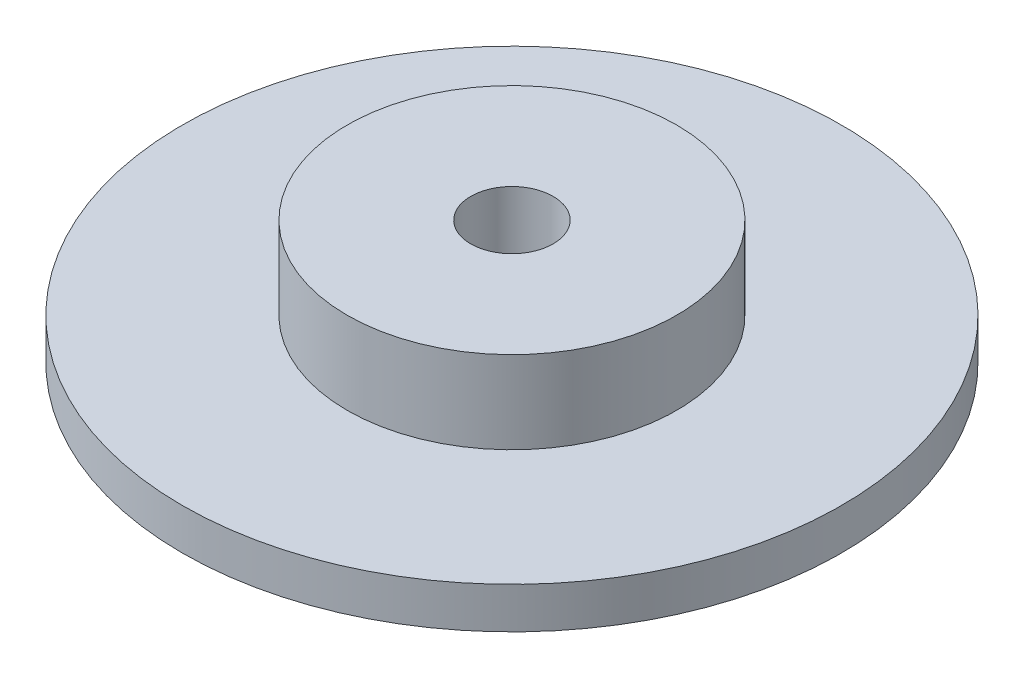
ISO-10303-21;
HEADER;
FILE_DESCRIPTION(('STEP AP214'),'2;1');
FILE_NAME('part.step','',(''),(''),'','','');
FILE_SCHEMA(('AUTOMOTIVE_DESIGN { 1 0 10303 214 1 1 1 1 }'));
ENDSEC;
DATA;
#1=APPLICATION_CONTEXT('core data for automotive mechanical design processes');
#2=APPLICATION_PROTOCOL_DEFINITION('international standard','automotive_design',2000,#1);
#3=PRODUCT_CONTEXT('',#1,'mechanical');
#4=PRODUCT('Part','Part','',(#3));
#5=PRODUCT_RELATED_PRODUCT_CATEGORY('part','',(#4));
#6=PRODUCT_DEFINITION_FORMATION('','',#4);
#7=PRODUCT_DEFINITION_CONTEXT('part definition',#1,'design');
#8=PRODUCT_DEFINITION('design','',#6,#7);
#9=PRODUCT_DEFINITION_SHAPE('','',#8);
#10=(LENGTH_UNIT() NAMED_UNIT(*) SI_UNIT(.MILLI.,.METRE.));
#11=(NAMED_UNIT(*) PLANE_ANGLE_UNIT() SI_UNIT($,.RADIAN.));
#12=(NAMED_UNIT(*) SI_UNIT($,.STERADIAN.) SOLID_ANGLE_UNIT());
#13=UNCERTAINTY_MEASURE_WITH_UNIT(LENGTH_MEASURE(1.E-05),#10,'distance_accuracy_value','');
#14=(GEOMETRIC_REPRESENTATION_CONTEXT(3) GLOBAL_UNCERTAINTY_ASSIGNED_CONTEXT((#13)) GLOBAL_UNIT_ASSIGNED_CONTEXT((#10,
#11,#12)) REPRESENTATION_CONTEXT('',''));
#15=CARTESIAN_POINT('',(0.,0.,0.));
#16=DIRECTION('',(0.,0.,1.));
#17=DIRECTION('',(1.,0.,0.));
#18=AXIS2_PLACEMENT_3D('',#15,#16,#17);
#19=CARTESIAN_POINT('',(0.,3.175,0.));
#20=DIRECTION('',(0.,1.,0.));
#21=DIRECTION('',(0.,0.,1.));
#22=AXIS2_PLACEMENT_3D('',#19,#20,#21);
#23=PLANE('',#22);
#24=CARTESIAN_POINT('',(0.,3.175,0.));
#25=DIRECTION('',(0.,1.,0.));
#26=DIRECTION('',(0.,0.,1.));
#27=AXIS2_PLACEMENT_3D('',#24,#25,#26);
#28=CIRCLE('',#27,25.4);
#29=CARTESIAN_POINT('',(0.,3.175,25.4));
#30=VERTEX_POINT('',#29);
#31=EDGE_CURVE('E10',#30,#30,#28,.T.);
#32=ORIENTED_EDGE('',*,*,#31,.T.);
#33=EDGE_LOOP('',(#32));
#34=FACE_BOUND('',#33,.T.);
#35=CARTESIAN_POINT('',(0.,3.175,0.));
#36=DIRECTION('',(0.,1.,0.));
#37=DIRECTION('',(0.,0.,1.));
#38=AXIS2_PLACEMENT_3D('',#35,#36,#37);
#39=CIRCLE('',#38,12.7);
#40=CARTESIAN_POINT('',(0.,3.175,12.7));
#41=VERTEX_POINT('',#40);
#42=EDGE_CURVE('E43',#41,#41,#39,.T.);
#43=ORIENTED_EDGE('',*,*,#42,.F.);
#44=EDGE_LOOP('',(#43));
#45=FACE_BOUND('',#44,.T.);
#46=ADVANCED_FACE('F30',(#34,#45),#23,.T.);
#47=CARTESIAN_POINT('',(0.,3.175,0.));
#48=DIRECTION('',(0.,-1.,0.));
#49=DIRECTION('',(0.,0.,-1.));
#50=AXIS2_PLACEMENT_3D('',#47,#48,#49);
#51=CYLINDRICAL_SURFACE('',#50,25.4);
#52=ORIENTED_EDGE('',*,*,#31,.F.);
#53=EDGE_LOOP('',(#52));
#54=FACE_BOUND('',#53,.T.);
#55=CARTESIAN_POINT('',(0.,0.,0.));
#56=DIRECTION('',(0.,1.,0.));
#57=DIRECTION('',(0.,0.,1.));
#58=AXIS2_PLACEMENT_3D('',#55,#56,#57);
#59=CIRCLE('',#58,25.4);
#60=CARTESIAN_POINT('',(0.,0.,25.4));
#61=VERTEX_POINT('',#60);
#62=EDGE_CURVE('E34',#61,#61,#59,.T.);
#63=ORIENTED_EDGE('',*,*,#62,.T.);
#64=EDGE_LOOP('',(#63));
#65=FACE_BOUND('',#64,.T.);
#66=ADVANCED_FACE('F32',(#54,#65),#51,.T.);
#67=CARTESIAN_POINT('',(0.,0.,0.));
#68=DIRECTION('',(0.,1.,0.));
#69=DIRECTION('',(0.,0.,1.));
#70=AXIS2_PLACEMENT_3D('',#67,#68,#69);
#71=PLANE('',#70);
#72=CARTESIAN_POINT('',(0.,0.,0.));
#73=DIRECTION('',(0.,1.,0.));
#74=DIRECTION('',(0.,0.,1.));
#75=AXIS2_PLACEMENT_3D('',#72,#73,#74);
#76=CIRCLE('',#75,3.175);
#77=CARTESIAN_POINT('',(0.,0.,3.175));
#78=VERTEX_POINT('',#77);
#79=EDGE_CURVE('E46',#78,#78,#76,.T.);
#80=ORIENTED_EDGE('',*,*,#79,.T.);
#81=EDGE_LOOP('',(#80));
#82=FACE_BOUND('',#81,.T.);
#83=ORIENTED_EDGE('',*,*,#62,.F.);
#84=EDGE_LOOP('',(#83));
#85=FACE_BOUND('',#84,.T.);
#86=ADVANCED_FACE('F55',(#82,#85),#71,.F.);
#87=CARTESIAN_POINT('',(0.,9.525,0.));
#88=DIRECTION('',(0.,-1.,0.));
#89=DIRECTION('',(0.,0.,-1.));
#90=AXIS2_PLACEMENT_3D('',#87,#88,#89);
#91=CYLINDRICAL_SURFACE('',#90,12.7);
#92=CARTESIAN_POINT('',(0.,9.525,0.));
#93=DIRECTION('',(0.,1.,0.));
#94=DIRECTION('',(0.,0.,1.));
#95=AXIS2_PLACEMENT_3D('',#92,#93,#94);
#96=CIRCLE('',#95,12.7);
#97=CARTESIAN_POINT('',(0.,9.525,12.7));
#98=VERTEX_POINT('',#97);
#99=EDGE_CURVE('E41',#98,#98,#96,.T.);
#100=ORIENTED_EDGE('',*,*,#99,.F.);
#101=EDGE_LOOP('',(#100));
#102=FACE_BOUND('',#101,.T.);
#103=ORIENTED_EDGE('',*,*,#42,.T.);
#104=EDGE_LOOP('',(#103));
#105=FACE_BOUND('',#104,.T.);
#106=ADVANCED_FACE('F67',(#102,#105),#91,.T.);
#107=CARTESIAN_POINT('',(0.,9.525,0.));
#108=DIRECTION('',(0.,1.,0.));
#109=DIRECTION('',(0.,0.,1.));
#110=AXIS2_PLACEMENT_3D('',#107,#108,#109);
#111=PLANE('',#110);
#112=CARTESIAN_POINT('',(0.,9.525,0.));
#113=DIRECTION('',(0.,1.,0.));
#114=DIRECTION('',(0.,0.,1.));
#115=AXIS2_PLACEMENT_3D('',#112,#113,#114);
#116=CIRCLE('',#115,3.175);
#117=CARTESIAN_POINT('',(0.,9.525,3.175));
#118=VERTEX_POINT('',#117);
#119=EDGE_CURVE('E49',#118,#118,#116,.T.);
#120=ORIENTED_EDGE('',*,*,#119,.F.);
#121=EDGE_LOOP('',(#120));
#122=FACE_BOUND('',#121,.T.);
#123=ORIENTED_EDGE('',*,*,#99,.T.);
#124=EDGE_LOOP('',(#123));
#125=FACE_BOUND('',#124,.T.);
#126=ADVANCED_FACE('F61',(#122,#125),#111,.T.);
#127=CARTESIAN_POINT('',(0.,0.,0.));
#128=DIRECTION('',(0.,1.,0.));
#129=DIRECTION('',(0.,0.,1.));
#130=AXIS2_PLACEMENT_3D('',#127,#128,#129);
#131=CYLINDRICAL_SURFACE('',#130,3.175);
#132=ORIENTED_EDGE('',*,*,#79,.F.);
#133=EDGE_LOOP('',(#132));
#134=FACE_BOUND('',#133,.T.);
#135=ORIENTED_EDGE('',*,*,#119,.T.);
#136=EDGE_LOOP('',(#135));
#137=FACE_BOUND('',#136,.T.);
#138=ADVANCED_FACE('F58',(#134,#137),#131,.F.);
#139=CLOSED_SHELL('',(#46,#66,#86,#106,#126,#138));
#140=MANIFOLD_SOLID_BREP('B2',#139);
#141=ADVANCED_BREP_SHAPE_REPRESENTATION('',(#18,#140),#14);
#142=SHAPE_DEFINITION_REPRESENTATION(#9,#141);
ENDSEC;
END-ISO-10303-21;
